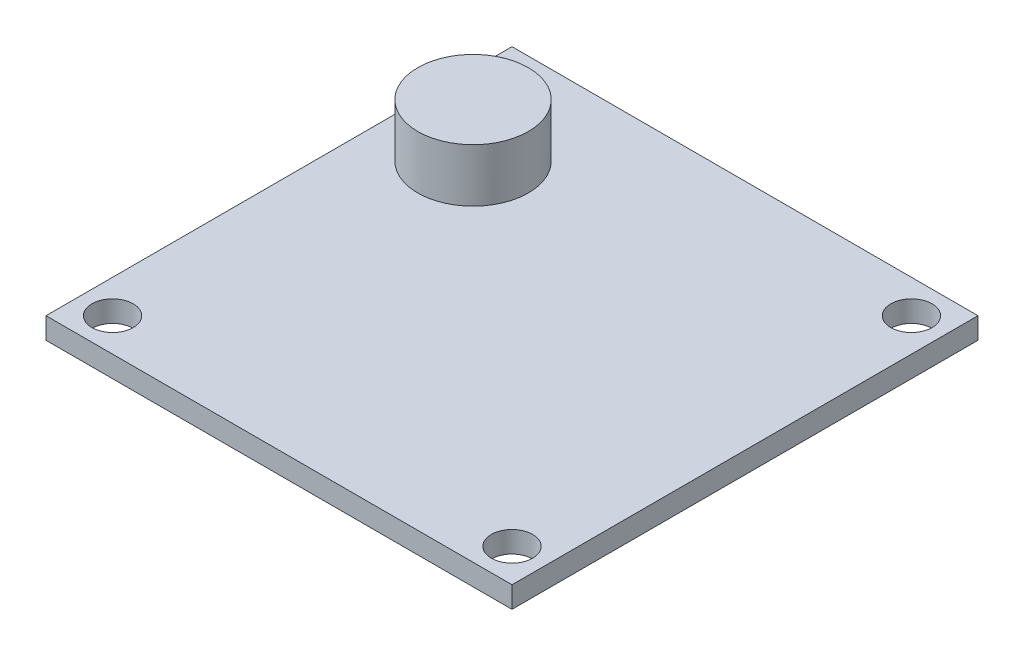
ISO-10303-21;
HEADER;
FILE_DESCRIPTION(('STEP AP214'),'2;1');
FILE_NAME('part.step','',(''),(''),'','','');
FILE_SCHEMA(('AUTOMOTIVE_DESIGN { 1 0 10303 214 1 1 1 1 }'));
ENDSEC;
DATA;
#1=APPLICATION_CONTEXT('core data for automotive mechanical design processes');
#2=APPLICATION_PROTOCOL_DEFINITION('international standard','automotive_design',2000,#1);
#3=PRODUCT_CONTEXT('',#1,'mechanical');
#4=PRODUCT('Part','Part','',(#3));
#5=PRODUCT_RELATED_PRODUCT_CATEGORY('part','',(#4));
#6=PRODUCT_DEFINITION_FORMATION('','',#4);
#7=PRODUCT_DEFINITION_CONTEXT('part definition',#1,'design');
#8=PRODUCT_DEFINITION('design','',#6,#7);
#9=PRODUCT_DEFINITION_SHAPE('','',#8);
#10=(LENGTH_UNIT() NAMED_UNIT(*) SI_UNIT(.MILLI.,.METRE.));
#11=(NAMED_UNIT(*) PLANE_ANGLE_UNIT() SI_UNIT($,.RADIAN.));
#12=(NAMED_UNIT(*) SI_UNIT($,.STERADIAN.) SOLID_ANGLE_UNIT());
#13=UNCERTAINTY_MEASURE_WITH_UNIT(LENGTH_MEASURE(1.E-05),#10,'distance_accuracy_value','');
#14=(GEOMETRIC_REPRESENTATION_CONTEXT(3) GLOBAL_UNCERTAINTY_ASSIGNED_CONTEXT((#13)) GLOBAL_UNIT_ASSIGNED_CONTEXT((#10,
#11,#12)) REPRESENTATION_CONTEXT('',''));
#15=CARTESIAN_POINT('',(0.,0.,0.));
#16=DIRECTION('',(0.,0.,1.));
#17=DIRECTION('',(1.,0.,0.));
#18=AXIS2_PLACEMENT_3D('',#15,#16,#17);
#19=CARTESIAN_POINT('',(0.,1.6,0.));
#20=DIRECTION('',(0.,-1.,0.));
#21=DIRECTION('',(0.,0.,-1.));
#22=AXIS2_PLACEMENT_3D('',#19,#20,#21);
#23=PLANE('',#22);
#24=CARTESIAN_POINT('',(-15.,1.6,15.));
#25=DIRECTION('',(0.,1.,0.));
#26=DIRECTION('',(0.,0.,-1.));
#27=AXIS2_PLACEMENT_3D('',#24,#25,#26);
#28=CIRCLE('',#27,1.55);
#29=CARTESIAN_POINT('',(-15.,1.6,13.45));
#30=VERTEX_POINT('',#29);
#31=EDGE_CURVE('E126',#30,#30,#28,.T.);
#32=ORIENTED_EDGE('',*,*,#31,.F.);
#33=EDGE_LOOP('',(#32));
#34=FACE_BOUND('',#33,.T.);
#35=CARTESIAN_POINT('',(15.,1.6,-15.));
#36=DIRECTION('',(0.,1.,0.));
#37=DIRECTION('',(0.,0.,-1.));
#38=AXIS2_PLACEMENT_3D('',#35,#36,#37);
#39=CIRCLE('',#38,1.55);
#40=CARTESIAN_POINT('',(15.,1.6,-16.55));
#41=VERTEX_POINT('',#40);
#42=EDGE_CURVE('E140',#41,#41,#39,.T.);
#43=ORIENTED_EDGE('',*,*,#42,.F.);
#44=EDGE_LOOP('',(#43));
#45=FACE_BOUND('',#44,.T.);
#46=DIRECTION('',(0.,0.,1.));
#47=VECTOR('',#46,1.);
#48=CARTESIAN_POINT('',(-17.5,1.6,-17.5));
#49=LINE('',#48,#47);
#50=CARTESIAN_POINT('',(-17.5,1.6,-17.5));
#51=VERTEX_POINT('',#50);
#52=CARTESIAN_POINT('',(-17.5,1.6,17.5));
#53=VERTEX_POINT('',#52);
#54=EDGE_CURVE('E88',#51,#53,#49,.T.);
#55=ORIENTED_EDGE('',*,*,#54,.T.);
#56=DIRECTION('',(1.,0.,0.));
#57=VECTOR('',#56,1.);
#58=CARTESIAN_POINT('',(17.5,1.6,17.5));
#59=LINE('',#58,#57);
#60=CARTESIAN_POINT('',(17.5,1.6,17.5));
#61=VERTEX_POINT('',#60);
#62=EDGE_CURVE('E83',#53,#61,#59,.T.);
#63=ORIENTED_EDGE('',*,*,#62,.T.);
#64=DIRECTION('',(0.,0.,-1.));
#65=VECTOR('',#64,1.);
#66=CARTESIAN_POINT('',(17.5,1.6,-17.5));
#67=LINE('',#66,#65);
#68=CARTESIAN_POINT('',(17.5,1.6,-17.5));
#69=VERTEX_POINT('',#68);
#70=EDGE_CURVE('E86',#61,#69,#67,.T.);
#71=ORIENTED_EDGE('',*,*,#70,.T.);
#72=DIRECTION('',(-1.,0.,0.));
#73=VECTOR('',#72,1.);
#74=CARTESIAN_POINT('',(17.5,1.6,-17.5));
#75=LINE('',#74,#73);
#76=EDGE_CURVE('E52',#69,#51,#75,.T.);
#77=ORIENTED_EDGE('',*,*,#76,.T.);
#78=EDGE_LOOP('',(#55,#63,#71,#77));
#79=FACE_BOUND('',#78,.T.);
#80=CARTESIAN_POINT('',(-15.,1.6,-15.));
#81=DIRECTION('',(0.,1.,0.));
#82=DIRECTION('',(0.,0.,1.));
#83=AXIS2_PLACEMENT_3D('',#80,#81,#82);
#84=CIRCLE('',#83,1.55);
#85=CARTESIAN_POINT('',(-15.,1.6,-13.45));
#86=VERTEX_POINT('',#85);
#87=EDGE_CURVE('E105',#86,#86,#84,.T.);
#88=ORIENTED_EDGE('',*,*,#87,.F.);
#89=EDGE_LOOP('',(#88));
#90=FACE_BOUND('',#89,.T.);
#91=CARTESIAN_POINT('',(15.,1.6,15.));
#92=DIRECTION('',(0.,1.,0.));
#93=DIRECTION('',(0.,0.,1.));
#94=AXIS2_PLACEMENT_3D('',#91,#92,#93);
#95=CIRCLE('',#94,1.55);
#96=CARTESIAN_POINT('',(15.,1.6,16.55));
#97=VERTEX_POINT('',#96);
#98=EDGE_CURVE('E135',#97,#97,#95,.T.);
#99=ORIENTED_EDGE('',*,*,#98,.F.);
#100=EDGE_LOOP('',(#99));
#101=FACE_BOUND('',#100,.T.);
#102=CARTESIAN_POINT('',(-11.5211847769542,1.6,-8.59552958753081));
#103=DIRECTION('',(0.,-1.,0.));
#104=DIRECTION('',(0.,0.,-1.));
#105=AXIS2_PLACEMENT_3D('',#102,#103,#104);
#106=CIRCLE('',#105,4.15425007309171);
#107=CARTESIAN_POINT('',(-11.5211847769542,1.6,-12.7497796606225));
#108=VERTEX_POINT('',#107);
#109=EDGE_CURVE('E11',#108,#108,#106,.F.);
#110=ORIENTED_EDGE('',*,*,#109,.F.);
#111=EDGE_LOOP('',(#110));
#112=FACE_BOUND('',#111,.T.);
#113=ADVANCED_FACE('F35',(#34,#45,#79,#90,#101,#112),#23,.F.);
#114=CARTESIAN_POINT('',(0.,0.,0.));
#115=DIRECTION('',(0.,-1.,0.));
#116=DIRECTION('',(0.,0.,-1.));
#117=AXIS2_PLACEMENT_3D('',#114,#115,#116);
#118=PLANE('',#117);
#119=CARTESIAN_POINT('',(15.,0.,15.));
#120=DIRECTION('',(0.,1.,0.));
#121=DIRECTION('',(0.,0.,1.));
#122=AXIS2_PLACEMENT_3D('',#119,#120,#121);
#123=CIRCLE('',#122,1.55);
#124=CARTESIAN_POINT('',(15.,0.,16.55));
#125=VERTEX_POINT('',#124);
#126=EDGE_CURVE('E130',#125,#125,#123,.T.);
#127=ORIENTED_EDGE('',*,*,#126,.T.);
#128=EDGE_LOOP('',(#127));
#129=FACE_BOUND('',#128,.T.);
#130=CARTESIAN_POINT('',(-15.,0.,-15.));
#131=DIRECTION('',(0.,1.,0.));
#132=DIRECTION('',(0.,0.,1.));
#133=AXIS2_PLACEMENT_3D('',#130,#131,#132);
#134=CIRCLE('',#133,1.55);
#135=CARTESIAN_POINT('',(-15.,0.,-13.45));
#136=VERTEX_POINT('',#135);
#137=EDGE_CURVE('E143',#136,#136,#134,.T.);
#138=ORIENTED_EDGE('',*,*,#137,.T.);
#139=EDGE_LOOP('',(#138));
#140=FACE_BOUND('',#139,.T.);
#141=DIRECTION('',(0.,0.,1.));
#142=VECTOR('',#141,1.);
#143=CARTESIAN_POINT('',(-17.5,0.,-17.5));
#144=LINE('',#143,#142);
#145=CARTESIAN_POINT('',(-17.5,0.,-17.5));
#146=VERTEX_POINT('',#145);
#147=CARTESIAN_POINT('',(-17.5,0.,17.5));
#148=VERTEX_POINT('',#147);
#149=EDGE_CURVE('E102',#146,#148,#144,.T.);
#150=ORIENTED_EDGE('',*,*,#149,.F.);
#151=DIRECTION('',(-1.,0.,0.));
#152=VECTOR('',#151,1.);
#153=CARTESIAN_POINT('',(17.5,0.,-17.5));
#154=LINE('',#153,#152);
#155=CARTESIAN_POINT('',(17.5,0.,-17.5));
#156=VERTEX_POINT('',#155);
#157=EDGE_CURVE('E75',#156,#146,#154,.T.);
#158=ORIENTED_EDGE('',*,*,#157,.F.);
#159=DIRECTION('',(0.,0.,-1.));
#160=VECTOR('',#159,1.);
#161=CARTESIAN_POINT('',(17.5,0.,-17.5));
#162=LINE('',#161,#160);
#163=CARTESIAN_POINT('',(17.5,0.,17.5));
#164=VERTEX_POINT('',#163);
#165=EDGE_CURVE('E69',#164,#156,#162,.T.);
#166=ORIENTED_EDGE('',*,*,#165,.F.);
#167=DIRECTION('',(1.,0.,0.));
#168=VECTOR('',#167,1.);
#169=CARTESIAN_POINT('',(17.5,0.,17.5));
#170=LINE('',#169,#168);
#171=EDGE_CURVE('E93',#148,#164,#170,.T.);
#172=ORIENTED_EDGE('',*,*,#171,.F.);
#173=EDGE_LOOP('',(#150,#158,#166,#172));
#174=FACE_BOUND('',#173,.T.);
#175=CARTESIAN_POINT('',(15.,0.,-15.));
#176=DIRECTION('',(0.,1.,0.));
#177=DIRECTION('',(0.,0.,-1.));
#178=AXIS2_PLACEMENT_3D('',#175,#176,#177);
#179=CIRCLE('',#178,1.55);
#180=CARTESIAN_POINT('',(15.,0.,-16.55));
#181=VERTEX_POINT('',#180);
#182=EDGE_CURVE('E121',#181,#181,#179,.T.);
#183=ORIENTED_EDGE('',*,*,#182,.T.);
#184=EDGE_LOOP('',(#183));
#185=FACE_BOUND('',#184,.T.);
#186=CARTESIAN_POINT('',(-15.,0.,15.));
#187=DIRECTION('',(0.,1.,0.));
#188=DIRECTION('',(0.,0.,-1.));
#189=AXIS2_PLACEMENT_3D('',#186,#187,#188);
#190=CIRCLE('',#189,1.55);
#191=CARTESIAN_POINT('',(-15.,0.,13.45));
#192=VERTEX_POINT('',#191);
#193=EDGE_CURVE('E124',#192,#192,#190,.T.);
#194=ORIENTED_EDGE('',*,*,#193,.T.);
#195=EDGE_LOOP('',(#194));
#196=FACE_BOUND('',#195,.T.);
#197=ADVANCED_FACE('F113',(#129,#140,#174,#185,#196),#118,.T.);
#198=CARTESIAN_POINT('',(-17.5,1.6,-17.5));
#199=DIRECTION('',(1.,0.,0.));
#200=DIRECTION('',(0.,0.,-1.));
#201=AXIS2_PLACEMENT_3D('',#198,#199,#200);
#202=PLANE('',#201);
#203=ORIENTED_EDGE('',*,*,#149,.T.);
#204=DIRECTION('',(0.,-1.,0.));
#205=VECTOR('',#204,1.);
#206=CARTESIAN_POINT('',(-17.5,1.6,17.5));
#207=LINE('',#206,#205);
#208=EDGE_CURVE('E44',#53,#148,#207,.T.);
#209=ORIENTED_EDGE('',*,*,#208,.F.);
#210=ORIENTED_EDGE('',*,*,#54,.F.);
#211=DIRECTION('',(0.,-1.,0.));
#212=VECTOR('',#211,1.);
#213=CARTESIAN_POINT('',(-17.5,1.6,-17.5));
#214=LINE('',#213,#212);
#215=EDGE_CURVE('E98',#51,#146,#214,.T.);
#216=ORIENTED_EDGE('',*,*,#215,.T.);
#217=EDGE_LOOP('',(#203,#209,#210,#216));
#218=FACE_BOUND('',#217,.T.);
#219=ADVANCED_FACE('F37',(#218),#202,.F.);
#220=CARTESIAN_POINT('',(17.5,1.6,17.5));
#221=DIRECTION('',(0.,0.,-1.));
#222=DIRECTION('',(-1.,0.,0.));
#223=AXIS2_PLACEMENT_3D('',#220,#221,#222);
#224=PLANE('',#223);
#225=ORIENTED_EDGE('',*,*,#171,.T.);
#226=DIRECTION('',(0.,-1.,0.));
#227=VECTOR('',#226,1.);
#228=CARTESIAN_POINT('',(17.5,1.6,17.5));
#229=LINE('',#228,#227);
#230=EDGE_CURVE('E91',#61,#164,#229,.T.);
#231=ORIENTED_EDGE('',*,*,#230,.F.);
#232=ORIENTED_EDGE('',*,*,#62,.F.);
#233=ORIENTED_EDGE('',*,*,#208,.T.);
#234=EDGE_LOOP('',(#225,#231,#232,#233));
#235=FACE_BOUND('',#234,.T.);
#236=ADVANCED_FACE('F92',(#235),#224,.F.);
#237=CARTESIAN_POINT('',(17.5,1.6,-17.5));
#238=DIRECTION('',(-1.,0.,0.));
#239=DIRECTION('',(0.,0.,1.));
#240=AXIS2_PLACEMENT_3D('',#237,#238,#239);
#241=PLANE('',#240);
#242=ORIENTED_EDGE('',*,*,#165,.T.);
#243=DIRECTION('',(0.,-1.,0.));
#244=VECTOR('',#243,1.);
#245=CARTESIAN_POINT('',(17.5,1.6,-17.5));
#246=LINE('',#245,#244);
#247=EDGE_CURVE('E94',#69,#156,#246,.T.);
#248=ORIENTED_EDGE('',*,*,#247,.F.);
#249=ORIENTED_EDGE('',*,*,#70,.F.);
#250=ORIENTED_EDGE('',*,*,#230,.T.);
#251=EDGE_LOOP('',(#242,#248,#249,#250));
#252=FACE_BOUND('',#251,.T.);
#253=ADVANCED_FACE('F96',(#252),#241,.F.);
#254=CARTESIAN_POINT('',(17.5,1.6,-17.5));
#255=DIRECTION('',(0.,0.,1.));
#256=DIRECTION('',(1.,0.,0.));
#257=AXIS2_PLACEMENT_3D('',#254,#255,#256);
#258=PLANE('',#257);
#259=ORIENTED_EDGE('',*,*,#157,.T.);
#260=ORIENTED_EDGE('',*,*,#215,.F.);
#261=ORIENTED_EDGE('',*,*,#76,.F.);
#262=ORIENTED_EDGE('',*,*,#247,.T.);
#263=EDGE_LOOP('',(#259,#260,#261,#262));
#264=FACE_BOUND('',#263,.T.);
#265=ADVANCED_FACE('F154',(#264),#258,.F.);
#266=CARTESIAN_POINT('',(-15.,1.6,-15.));
#267=DIRECTION('',(0.,-1.,0.));
#268=DIRECTION('',(0.,0.,-1.));
#269=AXIS2_PLACEMENT_3D('',#266,#267,#268);
#270=CYLINDRICAL_SURFACE('',#269,1.55);
#271=ORIENTED_EDGE('',*,*,#87,.T.);
#272=EDGE_LOOP('',(#271));
#273=FACE_BOUND('',#272,.T.);
#274=ORIENTED_EDGE('',*,*,#137,.F.);
#275=EDGE_LOOP('',(#274));
#276=FACE_BOUND('',#275,.T.);
#277=ADVANCED_FACE('F151',(#273,#276),#270,.F.);
#278=CARTESIAN_POINT('',(15.,1.6,-15.));
#279=DIRECTION('',(0.,-1.,0.));
#280=DIRECTION('',(0.,0.,-1.));
#281=AXIS2_PLACEMENT_3D('',#278,#279,#280);
#282=CYLINDRICAL_SURFACE('',#281,1.55);
#283=ORIENTED_EDGE('',*,*,#42,.T.);
#284=EDGE_LOOP('',(#283));
#285=FACE_BOUND('',#284,.T.);
#286=ORIENTED_EDGE('',*,*,#182,.F.);
#287=EDGE_LOOP('',(#286));
#288=FACE_BOUND('',#287,.T.);
#289=ADVANCED_FACE('F153',(#285,#288),#282,.F.);
#290=CARTESIAN_POINT('',(15.,1.6,15.));
#291=DIRECTION('',(0.,-1.,0.));
#292=DIRECTION('',(0.,0.,-1.));
#293=AXIS2_PLACEMENT_3D('',#290,#291,#292);
#294=CYLINDRICAL_SURFACE('',#293,1.55);
#295=ORIENTED_EDGE('',*,*,#98,.T.);
#296=EDGE_LOOP('',(#295));
#297=FACE_BOUND('',#296,.T.);
#298=ORIENTED_EDGE('',*,*,#126,.F.);
#299=EDGE_LOOP('',(#298));
#300=FACE_BOUND('',#299,.T.);
#301=ADVANCED_FACE('F161',(#297,#300),#294,.F.);
#302=CARTESIAN_POINT('',(-15.,1.6,15.));
#303=DIRECTION('',(0.,-1.,0.));
#304=DIRECTION('',(0.,0.,-1.));
#305=AXIS2_PLACEMENT_3D('',#302,#303,#304);
#306=CYLINDRICAL_SURFACE('',#305,1.55);
#307=ORIENTED_EDGE('',*,*,#31,.T.);
#308=EDGE_LOOP('',(#307));
#309=FACE_BOUND('',#308,.T.);
#310=ORIENTED_EDGE('',*,*,#193,.F.);
#311=EDGE_LOOP('',(#310));
#312=FACE_BOUND('',#311,.T.);
#313=ADVANCED_FACE('F219',(#309,#312),#306,.F.);
#314=CARTESIAN_POINT('',(-11.5211847769542,5.6,-8.59552958753081));
#315=DIRECTION('',(0.,-1.,0.));
#316=DIRECTION('',(0.,0.,-1.));
#317=AXIS2_PLACEMENT_3D('',#314,#315,#316);
#318=CYLINDRICAL_SURFACE('',#317,4.15425007309171);
#319=CARTESIAN_POINT('',(-11.5211847769542,5.6,-8.59552958753081));
#320=DIRECTION('',(0.,1.,0.));
#321=DIRECTION('',(0.,0.,1.));
#322=AXIS2_PLACEMENT_3D('',#319,#320,#321);
#323=CIRCLE('',#322,4.15425007309171);
#324=CARTESIAN_POINT('',(-11.5211847769542,5.6,-4.4412795144391));
#325=VERTEX_POINT('',#324);
#326=EDGE_CURVE('E127',#325,#325,#323,.T.);
#327=ORIENTED_EDGE('',*,*,#326,.F.);
#328=EDGE_LOOP('',(#327));
#329=FACE_BOUND('',#328,.T.);
#330=ORIENTED_EDGE('',*,*,#109,.T.);
#331=EDGE_LOOP('',(#330));
#332=FACE_BOUND('',#331,.T.);
#333=ADVANCED_FACE('F228',(#329,#332),#318,.T.);
#334=CARTESIAN_POINT('',(-11.5211847769542,5.6,-8.59552958753081));
#335=DIRECTION('',(0.,1.,0.));
#336=DIRECTION('',(0.,0.,1.));
#337=AXIS2_PLACEMENT_3D('',#334,#335,#336);
#338=PLANE('',#337);
#339=ORIENTED_EDGE('',*,*,#326,.T.);
#340=EDGE_LOOP('',(#339));
#341=FACE_BOUND('',#340,.T.);
#342=ADVANCED_FACE('F242',(#341),#338,.T.);
#343=CLOSED_SHELL('',(#113,#197,#219,#236,#253,#265,#277,#289,#301,#313,#333,#342));
#344=MANIFOLD_SOLID_BREP('B2',#343);
#345=ADVANCED_BREP_SHAPE_REPRESENTATION('',(#18,#344),#14);
#346=SHAPE_DEFINITION_REPRESENTATION(#9,#345);
ENDSEC;
END-ISO-10303-21;
